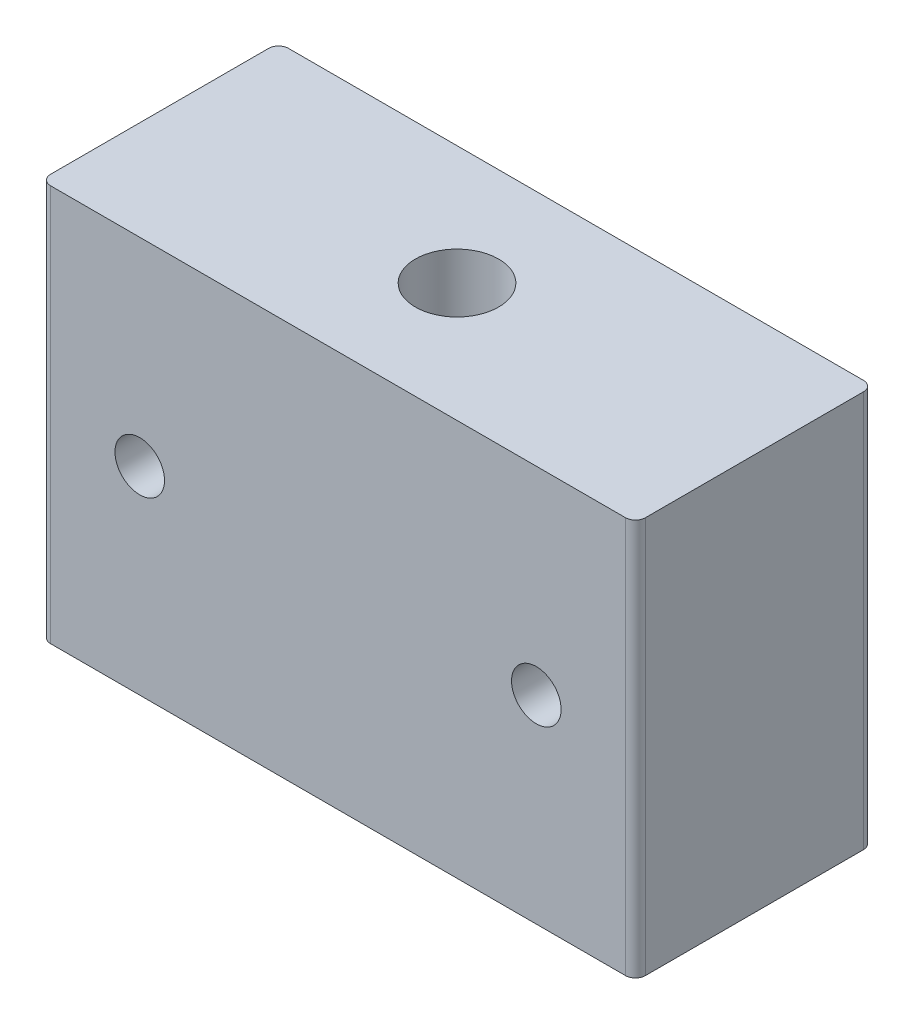
ISO-10303-21;
HEADER;
FILE_DESCRIPTION(('STEP AP214'),'2;1');
FILE_NAME('part.step','',(''),(''),'','','');
FILE_SCHEMA(('AUTOMOTIVE_DESIGN { 1 0 10303 214 1 1 1 1 }'));
ENDSEC;
DATA;
#1=APPLICATION_CONTEXT('core data for automotive mechanical design processes');
#2=APPLICATION_PROTOCOL_DEFINITION('international standard','automotive_design',2000,#1);
#3=PRODUCT_CONTEXT('',#1,'mechanical');
#4=PRODUCT('Part','Part','',(#3));
#5=PRODUCT_RELATED_PRODUCT_CATEGORY('part','',(#4));
#6=PRODUCT_DEFINITION_FORMATION('','',#4);
#7=PRODUCT_DEFINITION_CONTEXT('part definition',#1,'design');
#8=PRODUCT_DEFINITION('design','',#6,#7);
#9=PRODUCT_DEFINITION_SHAPE('','',#8);
#10=(LENGTH_UNIT() NAMED_UNIT(*) SI_UNIT(.MILLI.,.METRE.));
#11=(NAMED_UNIT(*) PLANE_ANGLE_UNIT() SI_UNIT($,.RADIAN.));
#12=(NAMED_UNIT(*) SI_UNIT($,.STERADIAN.) SOLID_ANGLE_UNIT());
#13=UNCERTAINTY_MEASURE_WITH_UNIT(LENGTH_MEASURE(1.E-05),#10,'distance_accuracy_value','');
#14=(GEOMETRIC_REPRESENTATION_CONTEXT(3) GLOBAL_UNCERTAINTY_ASSIGNED_CONTEXT((#13)) GLOBAL_UNIT_ASSIGNED_CONTEXT((#10,
#11,#12)) REPRESENTATION_CONTEXT('',''));
#15=CARTESIAN_POINT('',(0.,0.,0.));
#16=DIRECTION('',(0.,0.,1.));
#17=DIRECTION('',(1.,0.,0.));
#18=AXIS2_PLACEMENT_3D('',#15,#16,#17);
#19=CARTESIAN_POINT('',(-15.,20.,6.));
#20=DIRECTION('',(1.,0.,0.));
#21=DIRECTION('',(0.,0.,-1.));
#22=AXIS2_PLACEMENT_3D('',#19,#20,#21);
#23=PLANE('',#22);
#24=DIRECTION('',(0.,0.,1.));
#25=VECTOR('',#24,1.);
#26=CARTESIAN_POINT('',(-15.,20.,6.));
#27=LINE('',#26,#25);
#28=CARTESIAN_POINT('',(-15.,20.,-5.5));
#29=VERTEX_POINT('',#28);
#30=CARTESIAN_POINT('',(-15.,20.,5.5));
#31=VERTEX_POINT('',#30);
#32=EDGE_CURVE('E126',#29,#31,#27,.T.);
#33=ORIENTED_EDGE('',*,*,#32,.F.);
#34=DIRECTION('',(0.,-1.,0.));
#35=VECTOR('',#34,1.);
#36=CARTESIAN_POINT('',(-15.,20.,-5.5));
#37=LINE('',#36,#35);
#38=CARTESIAN_POINT('',(-15.,0.,-5.5));
#39=VERTEX_POINT('',#38);
#40=EDGE_CURVE('E110',#29,#39,#37,.T.);
#41=ORIENTED_EDGE('',*,*,#40,.T.);
#42=DIRECTION('',(0.,0.,1.));
#43=VECTOR('',#42,1.);
#44=CARTESIAN_POINT('',(-15.,0.,6.));
#45=LINE('',#44,#43);
#46=CARTESIAN_POINT('',(-15.,0.,5.5));
#47=VERTEX_POINT('',#46);
#48=EDGE_CURVE('E123',#39,#47,#45,.T.);
#49=ORIENTED_EDGE('',*,*,#48,.T.);
#50=DIRECTION('',(0.,-1.,0.));
#51=VECTOR('',#50,1.);
#52=CARTESIAN_POINT('',(-15.,20.,5.5));
#53=LINE('',#52,#51);
#54=EDGE_CURVE('E129',#47,#31,#53,.F.);
#55=ORIENTED_EDGE('',*,*,#54,.T.);
#56=EDGE_LOOP('',(#33,#41,#49,#55));
#57=FACE_BOUND('',#56,.T.);
#58=ADVANCED_FACE('F39',(#57),#23,.F.);
#59=CARTESIAN_POINT('',(15.,20.,6.));
#60=DIRECTION('',(0.,0.,-1.));
#61=DIRECTION('',(-1.,0.,0.));
#62=AXIS2_PLACEMENT_3D('',#59,#60,#61);
#63=PLANE('',#62);
#64=CARTESIAN_POINT('',(-10.,10.,6.));
#65=DIRECTION('',(0.,0.,1.));
#66=DIRECTION('',(1.,0.,0.));
#67=AXIS2_PLACEMENT_3D('',#64,#65,#66);
#68=CIRCLE('',#67,1.25);
#69=CARTESIAN_POINT('',(-8.75,10.,6.));
#70=VERTEX_POINT('',#69);
#71=EDGE_CURVE('E224',#70,#70,#68,.T.);
#72=ORIENTED_EDGE('',*,*,#71,.F.);
#73=EDGE_LOOP('',(#72));
#74=FACE_BOUND('',#73,.T.);
#75=CARTESIAN_POINT('',(10.,10.,6.));
#76=DIRECTION('',(0.,0.,1.));
#77=DIRECTION('',(1.,0.,0.));
#78=AXIS2_PLACEMENT_3D('',#75,#76,#77);
#79=CIRCLE('',#78,1.25);
#80=CARTESIAN_POINT('',(11.25,10.,6.));
#81=VERTEX_POINT('',#80);
#82=EDGE_CURVE('E216',#81,#81,#79,.T.);
#83=ORIENTED_EDGE('',*,*,#82,.F.);
#84=EDGE_LOOP('',(#83));
#85=FACE_BOUND('',#84,.T.);
#86=DIRECTION('',(1.,0.,0.));
#87=VECTOR('',#86,1.);
#88=CARTESIAN_POINT('',(15.,0.,6.));
#89=LINE('',#88,#87);
#90=CARTESIAN_POINT('',(-14.5,0.,6.));
#91=VERTEX_POINT('',#90);
#92=CARTESIAN_POINT('',(14.5,0.,6.));
#93=VERTEX_POINT('',#92);
#94=EDGE_CURVE('E134',#91,#93,#89,.T.);
#95=ORIENTED_EDGE('',*,*,#94,.T.);
#96=DIRECTION('',(0.,-1.,0.));
#97=VECTOR('',#96,1.);
#98=CARTESIAN_POINT('',(14.5,20.,6.));
#99=LINE('',#98,#97);
#100=CARTESIAN_POINT('',(14.5,20.,6.));
#101=VERTEX_POINT('',#100);
#102=EDGE_CURVE('E11',#93,#101,#99,.F.);
#103=ORIENTED_EDGE('',*,*,#102,.T.);
#104=DIRECTION('',(1.,0.,0.));
#105=VECTOR('',#104,1.);
#106=CARTESIAN_POINT('',(15.,20.,6.));
#107=LINE('',#106,#105);
#108=CARTESIAN_POINT('',(-14.5,20.,6.));
#109=VERTEX_POINT('',#108);
#110=EDGE_CURVE('E191',#109,#101,#107,.T.);
#111=ORIENTED_EDGE('',*,*,#110,.F.);
#112=DIRECTION('',(0.,-1.,0.));
#113=VECTOR('',#112,1.);
#114=CARTESIAN_POINT('',(-14.5,20.,6.));
#115=LINE('',#114,#113);
#116=EDGE_CURVE('E48',#109,#91,#115,.T.);
#117=ORIENTED_EDGE('',*,*,#116,.T.);
#118=EDGE_LOOP('',(#95,#103,#111,#117));
#119=FACE_BOUND('',#118,.T.);
#120=ADVANCED_FACE('F189',(#74,#85,#119),#63,.F.);
#121=CARTESIAN_POINT('',(15.,20.,6.));
#122=DIRECTION('',(-1.,0.,0.));
#123=DIRECTION('',(0.,0.,1.));
#124=AXIS2_PLACEMENT_3D('',#121,#122,#123);
#125=PLANE('',#124);
#126=DIRECTION('',(0.,0.,-1.));
#127=VECTOR('',#126,1.);
#128=CARTESIAN_POINT('',(15.,0.,6.));
#129=LINE('',#128,#127);
#130=CARTESIAN_POINT('',(15.,0.,5.5));
#131=VERTEX_POINT('',#130);
#132=CARTESIAN_POINT('',(15.,0.,-5.5));
#133=VERTEX_POINT('',#132);
#134=EDGE_CURVE('E140',#131,#133,#129,.T.);
#135=ORIENTED_EDGE('',*,*,#134,.T.);
#136=DIRECTION('',(0.,-1.,0.));
#137=VECTOR('',#136,1.);
#138=CARTESIAN_POINT('',(15.,20.,-5.5));
#139=LINE('',#138,#137);
#140=CARTESIAN_POINT('',(15.,20.,-5.5));
#141=VERTEX_POINT('',#140);
#142=EDGE_CURVE('E55',#133,#141,#139,.F.);
#143=ORIENTED_EDGE('',*,*,#142,.T.);
#144=DIRECTION('',(0.,0.,-1.));
#145=VECTOR('',#144,1.);
#146=CARTESIAN_POINT('',(15.,20.,6.));
#147=LINE('',#146,#145);
#148=CARTESIAN_POINT('',(15.,20.,5.5));
#149=VERTEX_POINT('',#148);
#150=EDGE_CURVE('E199',#149,#141,#147,.T.);
#151=ORIENTED_EDGE('',*,*,#150,.F.);
#152=DIRECTION('',(0.,-1.,0.));
#153=VECTOR('',#152,1.);
#154=CARTESIAN_POINT('',(15.,20.,5.5));
#155=LINE('',#154,#153);
#156=EDGE_CURVE('E179',#149,#131,#155,.T.);
#157=ORIENTED_EDGE('',*,*,#156,.T.);
#158=EDGE_LOOP('',(#135,#143,#151,#157));
#159=FACE_BOUND('',#158,.T.);
#160=ADVANCED_FACE('F198',(#159),#125,.F.);
#161=CARTESIAN_POINT('',(15.,20.,-6.));
#162=DIRECTION('',(0.,0.,1.));
#163=DIRECTION('',(1.,0.,0.));
#164=AXIS2_PLACEMENT_3D('',#161,#162,#163);
#165=PLANE('',#164);
#166=CARTESIAN_POINT('',(-10.,10.,-6.));
#167=DIRECTION('',(0.,0.,1.));
#168=DIRECTION('',(1.,0.,0.));
#169=AXIS2_PLACEMENT_3D('',#166,#167,#168);
#170=CIRCLE('',#169,1.25);
#171=CARTESIAN_POINT('',(-8.75,10.,-6.));
#172=VERTEX_POINT('',#171);
#173=EDGE_CURVE('E220',#172,#172,#170,.T.);
#174=ORIENTED_EDGE('',*,*,#173,.T.);
#175=EDGE_LOOP('',(#174));
#176=FACE_BOUND('',#175,.T.);
#177=CARTESIAN_POINT('',(10.,10.,-6.));
#178=DIRECTION('',(0.,0.,1.));
#179=DIRECTION('',(1.,0.,0.));
#180=AXIS2_PLACEMENT_3D('',#177,#178,#179);
#181=CIRCLE('',#180,1.25);
#182=CARTESIAN_POINT('',(11.25,10.,-6.));
#183=VERTEX_POINT('',#182);
#184=EDGE_CURVE('E212',#183,#183,#181,.T.);
#185=ORIENTED_EDGE('',*,*,#184,.T.);
#186=EDGE_LOOP('',(#185));
#187=FACE_BOUND('',#186,.T.);
#188=DIRECTION('',(-1.,0.,0.));
#189=VECTOR('',#188,1.);
#190=CARTESIAN_POINT('',(15.,0.,-6.));
#191=LINE('',#190,#189);
#192=CARTESIAN_POINT('',(14.5,0.,-6.));
#193=VERTEX_POINT('',#192);
#194=CARTESIAN_POINT('',(-14.5,0.,-6.));
#195=VERTEX_POINT('',#194);
#196=EDGE_CURVE('E151',#193,#195,#191,.T.);
#197=ORIENTED_EDGE('',*,*,#196,.T.);
#198=DIRECTION('',(0.,-1.,0.));
#199=VECTOR('',#198,1.);
#200=CARTESIAN_POINT('',(-14.5,20.,-6.));
#201=LINE('',#200,#199);
#202=CARTESIAN_POINT('',(-14.5,20.,-6.));
#203=VERTEX_POINT('',#202);
#204=EDGE_CURVE('E111',#195,#203,#201,.F.);
#205=ORIENTED_EDGE('',*,*,#204,.T.);
#206=DIRECTION('',(-1.,0.,0.));
#207=VECTOR('',#206,1.);
#208=CARTESIAN_POINT('',(15.,20.,-6.));
#209=LINE('',#208,#207);
#210=CARTESIAN_POINT('',(14.5,20.,-6.));
#211=VERTEX_POINT('',#210);
#212=EDGE_CURVE('E146',#211,#203,#209,.T.);
#213=ORIENTED_EDGE('',*,*,#212,.F.);
#214=DIRECTION('',(0.,-1.,0.));
#215=VECTOR('',#214,1.);
#216=CARTESIAN_POINT('',(14.5,20.,-6.));
#217=LINE('',#216,#215);
#218=EDGE_CURVE('E117',#211,#193,#217,.T.);
#219=ORIENTED_EDGE('',*,*,#218,.T.);
#220=EDGE_LOOP('',(#197,#205,#213,#219));
#221=FACE_BOUND('',#220,.T.);
#222=ADVANCED_FACE('F271',(#176,#187,#221),#165,.F.);
#223=CARTESIAN_POINT('',(0.,20.,0.));
#224=DIRECTION('',(0.,1.,0.));
#225=DIRECTION('',(0.,0.,1.));
#226=AXIS2_PLACEMENT_3D('',#223,#224,#225);
#227=PLANE('',#226);
#228=CARTESIAN_POINT('',(0.,20.,0.));
#229=DIRECTION('',(0.,-1.,0.));
#230=DIRECTION('',(0.,0.,-1.));
#231=AXIS2_PLACEMENT_3D('',#228,#229,#230);
#232=CIRCLE('',#231,2.1);
#233=CARTESIAN_POINT('',(0.,20.,-2.1));
#234=VERTEX_POINT('',#233);
#235=EDGE_CURVE('E135',#234,#234,#232,.T.);
#236=ORIENTED_EDGE('',*,*,#235,.T.);
#237=EDGE_LOOP('',(#236));
#238=FACE_BOUND('',#237,.T.);
#239=ORIENTED_EDGE('',*,*,#212,.T.);
#240=CARTESIAN_POINT('',(-14.5,20.,-5.5));
#241=DIRECTION('',(0.,1.,0.));
#242=DIRECTION('',(0.,0.,1.));
#243=AXIS2_PLACEMENT_3D('',#240,#241,#242);
#244=CIRCLE('',#243,0.5);
#245=EDGE_CURVE('E176',#203,#29,#244,.T.);
#246=ORIENTED_EDGE('',*,*,#245,.T.);
#247=ORIENTED_EDGE('',*,*,#32,.T.);
#248=CARTESIAN_POINT('',(-14.5,20.,5.5));
#249=DIRECTION('',(0.,1.,0.));
#250=DIRECTION('',(0.,0.,1.));
#251=AXIS2_PLACEMENT_3D('',#248,#249,#250);
#252=CIRCLE('',#251,0.5);
#253=EDGE_CURVE('E168',#31,#109,#252,.T.);
#254=ORIENTED_EDGE('',*,*,#253,.T.);
#255=ORIENTED_EDGE('',*,*,#110,.T.);
#256=CARTESIAN_POINT('',(14.5,20.,5.5));
#257=DIRECTION('',(0.,1.,0.));
#258=DIRECTION('',(0.,0.,1.));
#259=AXIS2_PLACEMENT_3D('',#256,#257,#258);
#260=CIRCLE('',#259,0.5);
#261=EDGE_CURVE('E62',#101,#149,#260,.T.);
#262=ORIENTED_EDGE('',*,*,#261,.T.);
#263=ORIENTED_EDGE('',*,*,#150,.T.);
#264=CARTESIAN_POINT('',(14.5,20.,-5.5));
#265=DIRECTION('',(0.,1.,0.));
#266=DIRECTION('',(0.,0.,1.));
#267=AXIS2_PLACEMENT_3D('',#264,#265,#266);
#268=CIRCLE('',#267,0.5);
#269=EDGE_CURVE('E173',#141,#211,#268,.T.);
#270=ORIENTED_EDGE('',*,*,#269,.T.);
#271=EDGE_LOOP('',(#239,#246,#247,#254,#255,#262,#263,#270));
#272=FACE_BOUND('',#271,.T.);
#273=ADVANCED_FACE('F267',(#238,#272),#227,.T.);
#274=CARTESIAN_POINT('',(0.,0.,0.));
#275=DIRECTION('',(0.,1.,0.));
#276=DIRECTION('',(0.,0.,1.));
#277=AXIS2_PLACEMENT_3D('',#274,#275,#276);
#278=PLANE('',#277);
#279=CARTESIAN_POINT('',(0.,0.,0.));
#280=DIRECTION('',(0.,-1.,0.));
#281=DIRECTION('',(0.,0.,-1.));
#282=AXIS2_PLACEMENT_3D('',#279,#280,#281);
#283=CIRCLE('',#282,2.1);
#284=CARTESIAN_POINT('',(0.,0.,-2.1));
#285=VERTEX_POINT('',#284);
#286=EDGE_CURVE('E143',#285,#285,#283,.T.);
#287=ORIENTED_EDGE('',*,*,#286,.F.);
#288=EDGE_LOOP('',(#287));
#289=FACE_BOUND('',#288,.T.);
#290=ORIENTED_EDGE('',*,*,#48,.F.);
#291=CARTESIAN_POINT('',(-14.5,0.,-5.5));
#292=DIRECTION('',(0.,1.,0.));
#293=DIRECTION('',(0.,0.,1.));
#294=AXIS2_PLACEMENT_3D('',#291,#292,#293);
#295=CIRCLE('',#294,0.5);
#296=EDGE_CURVE('E106',#39,#195,#295,.F.);
#297=ORIENTED_EDGE('',*,*,#296,.T.);
#298=ORIENTED_EDGE('',*,*,#196,.F.);
#299=CARTESIAN_POINT('',(14.5,0.,-5.5));
#300=DIRECTION('',(0.,1.,0.));
#301=DIRECTION('',(0.,0.,1.));
#302=AXIS2_PLACEMENT_3D('',#299,#300,#301);
#303=CIRCLE('',#302,0.5);
#304=EDGE_CURVE('E118',#193,#133,#303,.F.);
#305=ORIENTED_EDGE('',*,*,#304,.T.);
#306=ORIENTED_EDGE('',*,*,#134,.F.);
#307=CARTESIAN_POINT('',(14.5,0.,5.5));
#308=DIRECTION('',(0.,1.,0.));
#309=DIRECTION('',(0.,0.,1.));
#310=AXIS2_PLACEMENT_3D('',#307,#308,#309);
#311=CIRCLE('',#310,0.5);
#312=EDGE_CURVE('E158',#131,#93,#311,.F.);
#313=ORIENTED_EDGE('',*,*,#312,.T.);
#314=ORIENTED_EDGE('',*,*,#94,.F.);
#315=CARTESIAN_POINT('',(-14.5,0.,5.5));
#316=DIRECTION('',(0.,1.,0.));
#317=DIRECTION('',(0.,0.,1.));
#318=AXIS2_PLACEMENT_3D('',#315,#316,#317);
#319=CIRCLE('',#318,0.5);
#320=EDGE_CURVE('E128',#91,#47,#319,.F.);
#321=ORIENTED_EDGE('',*,*,#320,.T.);
#322=EDGE_LOOP('',(#290,#297,#298,#305,#306,#313,#314,#321));
#323=FACE_BOUND('',#322,.T.);
#324=ADVANCED_FACE('F131',(#289,#323),#278,.F.);
#325=CARTESIAN_POINT('',(0.,0.,0.));
#326=DIRECTION('',(0.,-1.,0.));
#327=DIRECTION('',(0.,0.,-1.));
#328=AXIS2_PLACEMENT_3D('',#325,#326,#327);
#329=CYLINDRICAL_SURFACE('',#328,2.1);
#330=ORIENTED_EDGE('',*,*,#235,.F.);
#331=EDGE_LOOP('',(#330));
#332=FACE_BOUND('',#331,.T.);
#333=ORIENTED_EDGE('',*,*,#286,.T.);
#334=EDGE_LOOP('',(#333));
#335=FACE_BOUND('',#334,.T.);
#336=ADVANCED_FACE('F238',(#332,#335),#329,.F.);
#337=CARTESIAN_POINT('',(10.,10.,6.));
#338=DIRECTION('',(0.,0.,1.));
#339=DIRECTION('',(1.,0.,0.));
#340=AXIS2_PLACEMENT_3D('',#337,#338,#339);
#341=CYLINDRICAL_SURFACE('',#340,1.25);
#342=ORIENTED_EDGE('',*,*,#184,.F.);
#343=EDGE_LOOP('',(#342));
#344=FACE_BOUND('',#343,.T.);
#345=ORIENTED_EDGE('',*,*,#82,.T.);
#346=EDGE_LOOP('',(#345));
#347=FACE_BOUND('',#346,.T.);
#348=ADVANCED_FACE('F236',(#344,#347),#341,.F.);
#349=CARTESIAN_POINT('',(-10.,10.,6.));
#350=DIRECTION('',(0.,0.,1.));
#351=DIRECTION('',(1.,0.,0.));
#352=AXIS2_PLACEMENT_3D('',#349,#350,#351);
#353=CYLINDRICAL_SURFACE('',#352,1.25);
#354=ORIENTED_EDGE('',*,*,#173,.F.);
#355=EDGE_LOOP('',(#354));
#356=FACE_BOUND('',#355,.T.);
#357=ORIENTED_EDGE('',*,*,#71,.T.);
#358=EDGE_LOOP('',(#357));
#359=FACE_BOUND('',#358,.T.);
#360=ADVANCED_FACE('F229',(#356,#359),#353,.F.);
#361=CARTESIAN_POINT('',(-14.5,20.,-5.5));
#362=DIRECTION('',(0.,-1.,0.));
#363=DIRECTION('',(0.,0.,-1.));
#364=AXIS2_PLACEMENT_3D('',#361,#362,#363);
#365=CYLINDRICAL_SURFACE('',#364,0.5);
#366=ORIENTED_EDGE('',*,*,#245,.F.);
#367=ORIENTED_EDGE('',*,*,#204,.F.);
#368=ORIENTED_EDGE('',*,*,#296,.F.);
#369=ORIENTED_EDGE('',*,*,#40,.F.);
#370=EDGE_LOOP('',(#366,#367,#368,#369));
#371=FACE_BOUND('',#370,.T.);
#372=ADVANCED_FACE('F109',(#371),#365,.T.);
#373=CARTESIAN_POINT('',(14.5,20.,-5.5));
#374=DIRECTION('',(0.,-1.,0.));
#375=DIRECTION('',(0.,0.,-1.));
#376=AXIS2_PLACEMENT_3D('',#373,#374,#375);
#377=CYLINDRICAL_SURFACE('',#376,0.5);
#378=ORIENTED_EDGE('',*,*,#269,.F.);
#379=ORIENTED_EDGE('',*,*,#142,.F.);
#380=ORIENTED_EDGE('',*,*,#304,.F.);
#381=ORIENTED_EDGE('',*,*,#218,.F.);
#382=EDGE_LOOP('',(#378,#379,#380,#381));
#383=FACE_BOUND('',#382,.T.);
#384=ADVANCED_FACE('F258',(#383),#377,.T.);
#385=CARTESIAN_POINT('',(14.5,20.,5.5));
#386=DIRECTION('',(0.,-1.,0.));
#387=DIRECTION('',(0.,0.,-1.));
#388=AXIS2_PLACEMENT_3D('',#385,#386,#387);
#389=CYLINDRICAL_SURFACE('',#388,0.5);
#390=ORIENTED_EDGE('',*,*,#261,.F.);
#391=ORIENTED_EDGE('',*,*,#102,.F.);
#392=ORIENTED_EDGE('',*,*,#312,.F.);
#393=ORIENTED_EDGE('',*,*,#156,.F.);
#394=EDGE_LOOP('',(#390,#391,#392,#393));
#395=FACE_BOUND('',#394,.T.);
#396=ADVANCED_FACE('F197',(#395),#389,.T.);
#397=CARTESIAN_POINT('',(-14.5,20.,5.5));
#398=DIRECTION('',(0.,-1.,0.));
#399=DIRECTION('',(0.,0.,-1.));
#400=AXIS2_PLACEMENT_3D('',#397,#398,#399);
#401=CYLINDRICAL_SURFACE('',#400,0.5);
#402=ORIENTED_EDGE('',*,*,#253,.F.);
#403=ORIENTED_EDGE('',*,*,#54,.F.);
#404=ORIENTED_EDGE('',*,*,#320,.F.);
#405=ORIENTED_EDGE('',*,*,#116,.F.);
#406=EDGE_LOOP('',(#402,#403,#404,#405));
#407=FACE_BOUND('',#406,.T.);
#408=ADVANCED_FACE('F41',(#407),#401,.T.);
#409=CLOSED_SHELL('',(#58,#120,#160,#222,#273,#324,#336,#348,#360,#372,#384,#396,#408));
#410=MANIFOLD_SOLID_BREP('B2',#409);
#411=ADVANCED_BREP_SHAPE_REPRESENTATION('',(#18,#410),#14);
#412=SHAPE_DEFINITION_REPRESENTATION(#9,#411);
ENDSEC;
END-ISO-10303-21;
